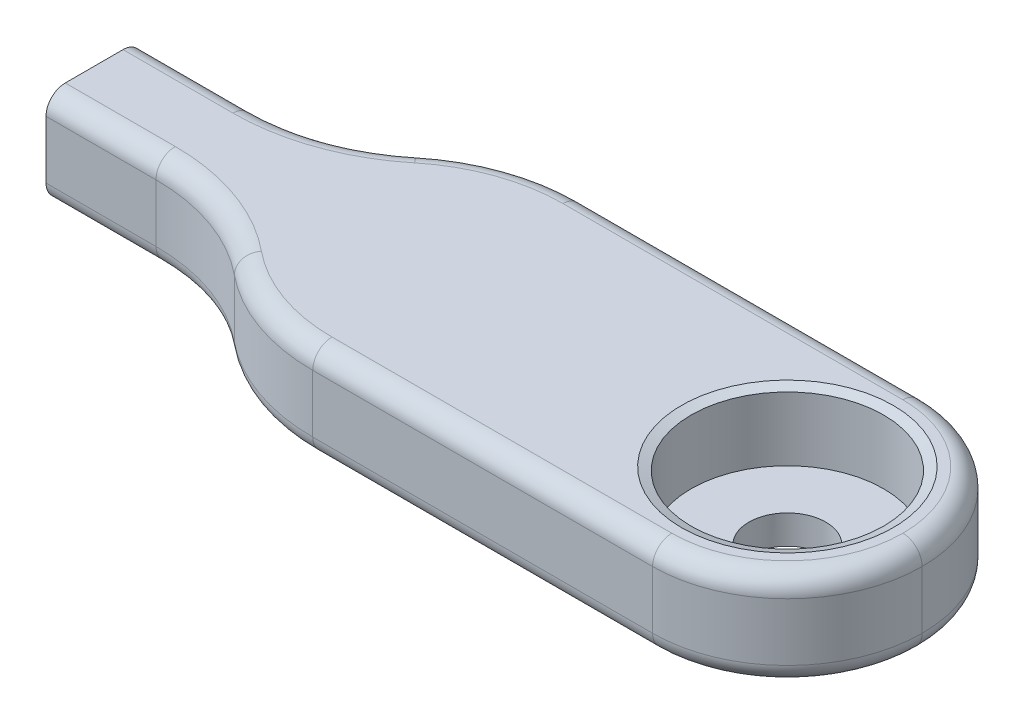
ISO-10303-21;
HEADER;
FILE_DESCRIPTION(('STEP AP214'),'2;1');
FILE_NAME('part.step','',(''),(''),'','','');
FILE_SCHEMA(('AUTOMOTIVE_DESIGN { 1 0 10303 214 1 1 1 1 }'));
ENDSEC;
DATA;
#1=APPLICATION_CONTEXT('core data for automotive mechanical design processes');
#2=APPLICATION_PROTOCOL_DEFINITION('international standard','automotive_design',2000,#1);
#3=PRODUCT_CONTEXT('',#1,'mechanical');
#4=PRODUCT('Part','Part','',(#3));
#5=PRODUCT_RELATED_PRODUCT_CATEGORY('part','',(#4));
#6=PRODUCT_DEFINITION_FORMATION('','',#4);
#7=PRODUCT_DEFINITION_CONTEXT('part definition',#1,'design');
#8=PRODUCT_DEFINITION('design','',#6,#7);
#9=PRODUCT_DEFINITION_SHAPE('','',#8);
#10=(LENGTH_UNIT() NAMED_UNIT(*) SI_UNIT(.MILLI.,.METRE.));
#11=(NAMED_UNIT(*) PLANE_ANGLE_UNIT() SI_UNIT($,.RADIAN.));
#12=(NAMED_UNIT(*) SI_UNIT($,.STERADIAN.) SOLID_ANGLE_UNIT());
#13=UNCERTAINTY_MEASURE_WITH_UNIT(LENGTH_MEASURE(1.E-05),#10,'distance_accuracy_value','');
#14=(GEOMETRIC_REPRESENTATION_CONTEXT(3) GLOBAL_UNCERTAINTY_ASSIGNED_CONTEXT((#13)) GLOBAL_UNIT_ASSIGNED_CONTEXT((#10,
#11,#12)) REPRESENTATION_CONTEXT('',''));
#15=CARTESIAN_POINT('',(0.,0.,0.));
#16=DIRECTION('',(0.,0.,1.));
#17=DIRECTION('',(1.,0.,0.));
#18=AXIS2_PLACEMENT_3D('',#15,#16,#17);
#19=CARTESIAN_POINT('',(-21.5,5.,-7.));
#20=DIRECTION('',(0.,0.,1.));
#21=DIRECTION('',(1.,0.,0.));
#22=AXIS2_PLACEMENT_3D('',#19,#20,#21);
#23=PLANE('',#22);
#24=DIRECTION('',(0.,-1.,0.));
#25=VECTOR('',#24,1.);
#26=CARTESIAN_POINT('',(14.5,5.,-7.));
#27=LINE('',#26,#25);
#28=CARTESIAN_POINT('',(14.5,4.,-7.));
#29=VERTEX_POINT('',#28);
#30=CARTESIAN_POINT('',(14.5,1.,-7.));
#31=VERTEX_POINT('',#30);
#32=EDGE_CURVE('E573',#29,#31,#27,.T.);
#33=ORIENTED_EDGE('',*,*,#32,.T.);
#34=DIRECTION('',(-1.,0.,0.));
#35=VECTOR('',#34,1.);
#36=CARTESIAN_POINT('',(-3.14835345575496,1.,-7.));
#37=LINE('',#36,#35);
#38=CARTESIAN_POINT('',(-3.14835345575496,1.,-7.));
#39=VERTEX_POINT('',#38);
#40=EDGE_CURVE('E243',#31,#39,#37,.T.);
#41=ORIENTED_EDGE('',*,*,#40,.T.);
#42=DIRECTION('',(0.,-1.,0.));
#43=VECTOR('',#42,1.);
#44=CARTESIAN_POINT('',(-3.14835345575496,5.,-7.));
#45=LINE('',#44,#43);
#46=CARTESIAN_POINT('',(-3.14835345575496,4.,-7.));
#47=VERTEX_POINT('',#46);
#48=EDGE_CURVE('E550',#39,#47,#45,.F.);
#49=ORIENTED_EDGE('',*,*,#48,.T.);
#50=DIRECTION('',(-1.,0.,0.));
#51=VECTOR('',#50,1.);
#52=CARTESIAN_POINT('',(-21.5,4.,-7.));
#53=LINE('',#52,#51);
#54=EDGE_CURVE('E240',#47,#29,#53,.F.);
#55=ORIENTED_EDGE('',*,*,#54,.T.);
#56=EDGE_LOOP('',(#33,#41,#49,#55));
#57=FACE_BOUND('',#56,.T.);
#58=ADVANCED_FACE('F41',(#57),#23,.F.);
#59=CARTESIAN_POINT('',(-21.5,5.,7.));
#60=DIRECTION('',(1.,0.,0.));
#61=DIRECTION('',(0.,0.,-1.));
#62=AXIS2_PLACEMENT_3D('',#59,#60,#61);
#63=PLANE('',#62);
#64=CARTESIAN_POINT('',(-21.5,2.5,0.));
#65=DIRECTION('',(-1.,0.,0.));
#66=DIRECTION('',(0.,0.,1.));
#67=AXIS2_PLACEMENT_3D('',#64,#65,#66);
#68=CIRCLE('',#67,2.2);
#69=CARTESIAN_POINT('',(-21.5,2.5,2.2));
#70=VERTEX_POINT('',#69);
#71=EDGE_CURVE('E364',#70,#70,#68,.T.);
#72=ORIENTED_EDGE('',*,*,#71,.F.);
#73=EDGE_LOOP('',(#72));
#74=FACE_BOUND('',#73,.T.);
#75=DIRECTION('',(0.,1.,0.));
#76=VECTOR('',#75,1.);
#77=CARTESIAN_POINT('',(-21.5,-5.,-2.5));
#78=LINE('',#77,#76);
#79=CARTESIAN_POINT('',(-21.5,1.,-2.5));
#80=VERTEX_POINT('',#79);
#81=CARTESIAN_POINT('',(-21.5,4.,-2.5));
#82=VERTEX_POINT('',#81);
#83=EDGE_CURVE('E198',#80,#82,#78,.T.);
#84=ORIENTED_EDGE('',*,*,#83,.F.);
#85=CARTESIAN_POINT('',(-21.5,1.,-1.5));
#86=DIRECTION('',(1.,0.,0.));
#87=DIRECTION('',(0.,0.,-1.));
#88=AXIS2_PLACEMENT_3D('',#85,#86,#87);
#89=CIRCLE('',#88,1.);
#90=CARTESIAN_POINT('',(-21.5,0.,-1.5));
#91=VERTEX_POINT('',#90);
#92=EDGE_CURVE('E193',#80,#91,#89,.F.);
#93=ORIENTED_EDGE('',*,*,#92,.T.);
#94=DIRECTION('',(0.,0.,1.));
#95=VECTOR('',#94,1.);
#96=CARTESIAN_POINT('',(-21.5,0.,7.));
#97=LINE('',#96,#95);
#98=CARTESIAN_POINT('',(-21.5,0.,1.5));
#99=VERTEX_POINT('',#98);
#100=EDGE_CURVE('E196',#91,#99,#97,.T.);
#101=ORIENTED_EDGE('',*,*,#100,.T.);
#102=CARTESIAN_POINT('',(-21.5,1.,1.5));
#103=DIRECTION('',(1.,0.,0.));
#104=DIRECTION('',(0.,0.,-1.));
#105=AXIS2_PLACEMENT_3D('',#102,#103,#104);
#106=CIRCLE('',#105,1.);
#107=CARTESIAN_POINT('',(-21.5,1.,2.5));
#108=VERTEX_POINT('',#107);
#109=EDGE_CURVE('E65',#99,#108,#106,.F.);
#110=ORIENTED_EDGE('',*,*,#109,.T.);
#111=DIRECTION('',(0.,1.,0.));
#112=VECTOR('',#111,1.);
#113=CARTESIAN_POINT('',(-21.5,-5.,2.5));
#114=LINE('',#113,#112);
#115=CARTESIAN_POINT('',(-21.5,4.,2.5));
#116=VERTEX_POINT('',#115);
#117=EDGE_CURVE('E541',#108,#116,#114,.T.);
#118=ORIENTED_EDGE('',*,*,#117,.T.);
#119=CARTESIAN_POINT('',(-21.5,4.,1.5));
#120=DIRECTION('',(1.,0.,0.));
#121=DIRECTION('',(0.,0.,-1.));
#122=AXIS2_PLACEMENT_3D('',#119,#120,#121);
#123=CIRCLE('',#122,1.);
#124=CARTESIAN_POINT('',(-21.5,5.,1.5));
#125=VERTEX_POINT('',#124);
#126=EDGE_CURVE('E313',#116,#125,#123,.F.);
#127=ORIENTED_EDGE('',*,*,#126,.T.);
#128=DIRECTION('',(0.,0.,1.));
#129=VECTOR('',#128,1.);
#130=CARTESIAN_POINT('',(-21.5,5.,7.));
#131=LINE('',#130,#129);
#132=CARTESIAN_POINT('',(-21.5,5.,-1.5));
#133=VERTEX_POINT('',#132);
#134=EDGE_CURVE('E213',#133,#125,#131,.T.);
#135=ORIENTED_EDGE('',*,*,#134,.F.);
#136=CARTESIAN_POINT('',(-21.5,4.,-1.5));
#137=DIRECTION('',(1.,0.,0.));
#138=DIRECTION('',(0.,0.,-1.));
#139=AXIS2_PLACEMENT_3D('',#136,#137,#138);
#140=CIRCLE('',#139,1.);
#141=EDGE_CURVE('E203',#133,#82,#140,.F.);
#142=ORIENTED_EDGE('',*,*,#141,.T.);
#143=EDGE_LOOP('',(#84,#93,#101,#110,#118,#127,#135,#142));
#144=FACE_BOUND('',#143,.T.);
#145=ADVANCED_FACE('F195',(#74,#144),#63,.F.);
#146=CARTESIAN_POINT('',(-21.5,5.,7.));
#147=DIRECTION('',(0.,0.,-1.));
#148=DIRECTION('',(-1.,0.,0.));
#149=AXIS2_PLACEMENT_3D('',#146,#147,#148);
#150=PLANE('',#149);
#151=DIRECTION('',(0.,1.,0.));
#152=VECTOR('',#151,1.);
#153=CARTESIAN_POINT('',(-3.14835345575497,5.,7.));
#154=LINE('',#153,#152);
#155=CARTESIAN_POINT('',(-3.14835345575497,4.,7.));
#156=VERTEX_POINT('',#155);
#157=CARTESIAN_POINT('',(-3.14835345575497,1.,7.));
#158=VERTEX_POINT('',#157);
#159=EDGE_CURVE('E546',#156,#158,#154,.F.);
#160=ORIENTED_EDGE('',*,*,#159,.T.);
#161=DIRECTION('',(1.,0.,0.));
#162=VECTOR('',#161,1.);
#163=CARTESIAN_POINT('',(14.5,1.,7.));
#164=LINE('',#163,#162);
#165=CARTESIAN_POINT('',(14.5,1.,7.));
#166=VERTEX_POINT('',#165);
#167=EDGE_CURVE('E261',#158,#166,#164,.T.);
#168=ORIENTED_EDGE('',*,*,#167,.T.);
#169=DIRECTION('',(0.,-1.,0.));
#170=VECTOR('',#169,1.);
#171=CARTESIAN_POINT('',(14.5,5.,7.));
#172=LINE('',#171,#170);
#173=CARTESIAN_POINT('',(14.5,4.,7.));
#174=VERTEX_POINT('',#173);
#175=EDGE_CURVE('E576',#166,#174,#172,.F.);
#176=ORIENTED_EDGE('',*,*,#175,.T.);
#177=DIRECTION('',(1.,0.,0.));
#178=VECTOR('',#177,1.);
#179=CARTESIAN_POINT('',(-21.5,4.,7.));
#180=LINE('',#179,#178);
#181=EDGE_CURVE('E258',#174,#156,#180,.F.);
#182=ORIENTED_EDGE('',*,*,#181,.T.);
#183=EDGE_LOOP('',(#160,#168,#176,#182));
#184=FACE_BOUND('',#183,.T.);
#185=ADVANCED_FACE('F419',(#184),#150,.F.);
#186=CARTESIAN_POINT('',(0.,5.,0.));
#187=DIRECTION('',(0.,-1.,0.));
#188=DIRECTION('',(0.,0.,-1.));
#189=AXIS2_PLACEMENT_3D('',#186,#187,#188);
#190=PLANE('',#189);
#191=CARTESIAN_POINT('',(14.5,5.,0.));
#192=DIRECTION('',(0.,-1.,0.));
#193=DIRECTION('',(0.,0.,-1.));
#194=AXIS2_PLACEMENT_3D('',#191,#192,#193);
#195=CIRCLE('',#194,5.50000000000001);
#196=CARTESIAN_POINT('',(14.5,5.,-5.50000000000001));
#197=VERTEX_POINT('',#196);
#198=EDGE_CURVE('E587',#197,#197,#195,.T.);
#199=ORIENTED_EDGE('',*,*,#198,.T.);
#200=EDGE_LOOP('',(#199));
#201=FACE_BOUND('',#200,.T.);
#202=CARTESIAN_POINT('',(-15.7875781155195,5.,-12.5));
#203=DIRECTION('',(0.,-1.,0.));
#204=DIRECTION('',(0.,0.,-1.));
#205=AXIS2_PLACEMENT_3D('',#202,#203,#204);
#206=CIRCLE('',#205,11.);
#207=CARTESIAN_POINT('',(-8.83600455264901,5.,-3.975));
#208=VERTEX_POINT('',#207);
#209=CARTESIAN_POINT('',(-15.7875781155195,5.,-1.5));
#210=VERTEX_POINT('',#209);
#211=EDGE_CURVE('E300',#208,#210,#206,.T.);
#212=ORIENTED_EDGE('',*,*,#211,.T.);
#213=DIRECTION('',(1.,0.,0.));
#214=VECTOR('',#213,1.);
#215=CARTESIAN_POINT('',(0.,5.,-1.5));
#216=LINE('',#215,#214);
#217=EDGE_CURVE('E304',#210,#133,#216,.F.);
#218=ORIENTED_EDGE('',*,*,#217,.T.);
#219=ORIENTED_EDGE('',*,*,#134,.T.);
#220=DIRECTION('',(-1.,0.,0.));
#221=VECTOR('',#220,1.);
#222=CARTESIAN_POINT('',(0.,5.,1.5));
#223=LINE('',#222,#221);
#224=CARTESIAN_POINT('',(-15.7875781155195,5.,1.5));
#225=VERTEX_POINT('',#224);
#226=EDGE_CURVE('E276',#125,#225,#223,.F.);
#227=ORIENTED_EDGE('',*,*,#226,.T.);
#228=CARTESIAN_POINT('',(-15.7875781155195,5.,12.5));
#229=DIRECTION('',(0.,-1.,0.));
#230=DIRECTION('',(0.,0.,-1.));
#231=AXIS2_PLACEMENT_3D('',#228,#229,#230);
#232=CIRCLE('',#231,11.);
#233=CARTESIAN_POINT('',(-8.83600455264901,5.,3.975));
#234=VERTEX_POINT('',#233);
#235=EDGE_CURVE('E279',#225,#234,#232,.T.);
#236=ORIENTED_EDGE('',*,*,#235,.T.);
#237=CARTESIAN_POINT('',(-3.14835345575497,5.,-3.));
#238=DIRECTION('',(0.,-1.,0.));
#239=DIRECTION('',(0.,0.,-1.));
#240=AXIS2_PLACEMENT_3D('',#237,#238,#239);
#241=CIRCLE('',#240,9.);
#242=CARTESIAN_POINT('',(-3.14835345575497,5.,6.));
#243=VERTEX_POINT('',#242);
#244=EDGE_CURVE('E282',#234,#243,#241,.F.);
#245=ORIENTED_EDGE('',*,*,#244,.T.);
#246=DIRECTION('',(1.,0.,0.));
#247=VECTOR('',#246,1.);
#248=CARTESIAN_POINT('',(0.,5.,6.));
#249=LINE('',#248,#247);
#250=CARTESIAN_POINT('',(14.5,5.,6.));
#251=VERTEX_POINT('',#250);
#252=EDGE_CURVE('E285',#243,#251,#249,.T.);
#253=ORIENTED_EDGE('',*,*,#252,.T.);
#254=CARTESIAN_POINT('',(14.5,5.,0.));
#255=DIRECTION('',(0.,-1.,0.));
#256=DIRECTION('',(0.,0.,-1.));
#257=AXIS2_PLACEMENT_3D('',#254,#255,#256);
#258=CIRCLE('',#257,6.);
#259=CARTESIAN_POINT('',(20.5,5.,0.));
#260=VERTEX_POINT('',#259);
#261=EDGE_CURVE('E288',#251,#260,#258,.F.);
#262=ORIENTED_EDGE('',*,*,#261,.T.);
#263=CARTESIAN_POINT('',(14.5,5.,0.));
#264=DIRECTION('',(0.,-1.,0.));
#265=DIRECTION('',(0.,0.,-1.));
#266=AXIS2_PLACEMENT_3D('',#263,#264,#265);
#267=CIRCLE('',#266,6.);
#268=CARTESIAN_POINT('',(14.5,5.,-6.));
#269=VERTEX_POINT('',#268);
#270=EDGE_CURVE('E291',#260,#269,#267,.F.);
#271=ORIENTED_EDGE('',*,*,#270,.T.);
#272=DIRECTION('',(-1.,0.,0.));
#273=VECTOR('',#272,1.);
#274=CARTESIAN_POINT('',(0.,5.,-6.));
#275=LINE('',#274,#273);
#276=CARTESIAN_POINT('',(-3.14835345575496,5.,-6.));
#277=VERTEX_POINT('',#276);
#278=EDGE_CURVE('E294',#269,#277,#275,.T.);
#279=ORIENTED_EDGE('',*,*,#278,.T.);
#280=CARTESIAN_POINT('',(-3.14835345575497,5.,3.));
#281=DIRECTION('',(0.,-1.,0.));
#282=DIRECTION('',(0.,0.,-1.));
#283=AXIS2_PLACEMENT_3D('',#280,#281,#282);
#284=CIRCLE('',#283,9.);
#285=EDGE_CURVE('E297',#277,#208,#284,.F.);
#286=ORIENTED_EDGE('',*,*,#285,.T.);
#287=EDGE_LOOP('',(#212,#218,#219,#227,#236,#245,#253,#262,#271,#279,#286));
#288=FACE_BOUND('',#287,.T.);
#289=ADVANCED_FACE('F543',(#201,#288),#190,.F.);
#290=CARTESIAN_POINT('',(0.,0.,0.));
#291=DIRECTION('',(0.,-1.,0.));
#292=DIRECTION('',(0.,0.,-1.));
#293=AXIS2_PLACEMENT_3D('',#290,#291,#292);
#294=PLANE('',#293);
#295=CARTESIAN_POINT('',(14.5,0.,0.));
#296=DIRECTION('',(0.,-1.,0.));
#297=DIRECTION('',(0.,0.,-1.));
#298=AXIS2_PLACEMENT_3D('',#295,#296,#297);
#299=CIRCLE('',#298,2.);
#300=CARTESIAN_POINT('',(14.5,0.,-2.));
#301=VERTEX_POINT('',#300);
#302=EDGE_CURVE('E45',#301,#301,#299,.T.);
#303=ORIENTED_EDGE('',*,*,#302,.F.);
#304=EDGE_LOOP('',(#303));
#305=FACE_BOUND('',#304,.T.);
#306=ORIENTED_EDGE('',*,*,#100,.F.);
#307=DIRECTION('',(-1.,0.,0.));
#308=VECTOR('',#307,1.);
#309=CARTESIAN_POINT('',(-15.7875781155195,0.,-1.5));
#310=LINE('',#309,#308);
#311=CARTESIAN_POINT('',(-15.7875781155195,0.,-1.5));
#312=VERTEX_POINT('',#311);
#313=EDGE_CURVE('E208',#91,#312,#310,.F.);
#314=ORIENTED_EDGE('',*,*,#313,.T.);
#315=CARTESIAN_POINT('',(-15.7875781155195,0.,-12.5));
#316=DIRECTION('',(0.,-1.,0.));
#317=DIRECTION('',(0.,0.,-1.));
#318=AXIS2_PLACEMENT_3D('',#315,#316,#317);
#319=CIRCLE('',#318,11.);
#320=CARTESIAN_POINT('',(-8.83600455264901,0.,-3.975));
#321=VERTEX_POINT('',#320);
#322=EDGE_CURVE('E222',#312,#321,#319,.F.);
#323=ORIENTED_EDGE('',*,*,#322,.T.);
#324=CARTESIAN_POINT('',(-3.14835345575497,0.,3.));
#325=DIRECTION('',(0.,-1.,0.));
#326=DIRECTION('',(0.,0.,-1.));
#327=AXIS2_PLACEMENT_3D('',#324,#325,#326);
#328=CIRCLE('',#327,9.);
#329=CARTESIAN_POINT('',(-3.14835345575496,0.,-6.));
#330=VERTEX_POINT('',#329);
#331=EDGE_CURVE('E228',#321,#330,#328,.T.);
#332=ORIENTED_EDGE('',*,*,#331,.T.);
#333=DIRECTION('',(-1.,0.,0.));
#334=VECTOR('',#333,1.);
#335=CARTESIAN_POINT('',(14.5,0.,-6.));
#336=LINE('',#335,#334);
#337=CARTESIAN_POINT('',(14.5,0.,-6.));
#338=VERTEX_POINT('',#337);
#339=EDGE_CURVE('E608',#330,#338,#336,.F.);
#340=ORIENTED_EDGE('',*,*,#339,.T.);
#341=CARTESIAN_POINT('',(14.5,0.,0.));
#342=DIRECTION('',(0.,-1.,0.));
#343=DIRECTION('',(0.,0.,-1.));
#344=AXIS2_PLACEMENT_3D('',#341,#342,#343);
#345=CIRCLE('',#344,6.);
#346=CARTESIAN_POINT('',(20.5,0.,0.));
#347=VERTEX_POINT('',#346);
#348=EDGE_CURVE('E605',#338,#347,#345,.T.);
#349=ORIENTED_EDGE('',*,*,#348,.T.);
#350=CARTESIAN_POINT('',(14.5,0.,0.));
#351=DIRECTION('',(0.,-1.,0.));
#352=DIRECTION('',(0.,0.,-1.));
#353=AXIS2_PLACEMENT_3D('',#350,#351,#352);
#354=CIRCLE('',#353,6.);
#355=CARTESIAN_POINT('',(14.5,0.,6.));
#356=VERTEX_POINT('',#355);
#357=EDGE_CURVE('E602',#347,#356,#354,.T.);
#358=ORIENTED_EDGE('',*,*,#357,.T.);
#359=DIRECTION('',(1.,0.,0.));
#360=VECTOR('',#359,1.);
#361=CARTESIAN_POINT('',(-3.14835345575497,0.,6.));
#362=LINE('',#361,#360);
#363=CARTESIAN_POINT('',(-3.14835345575497,0.,6.));
#364=VERTEX_POINT('',#363);
#365=EDGE_CURVE('E599',#356,#364,#362,.F.);
#366=ORIENTED_EDGE('',*,*,#365,.T.);
#367=CARTESIAN_POINT('',(-3.14835345575497,0.,-3.));
#368=DIRECTION('',(0.,-1.,0.));
#369=DIRECTION('',(0.,0.,-1.));
#370=AXIS2_PLACEMENT_3D('',#367,#368,#369);
#371=CIRCLE('',#370,9.);
#372=CARTESIAN_POINT('',(-8.83600455264901,0.,3.975));
#373=VERTEX_POINT('',#372);
#374=EDGE_CURVE('E596',#364,#373,#371,.T.);
#375=ORIENTED_EDGE('',*,*,#374,.T.);
#376=CARTESIAN_POINT('',(-15.7875781155195,0.,12.5));
#377=DIRECTION('',(0.,-1.,0.));
#378=DIRECTION('',(0.,0.,-1.));
#379=AXIS2_PLACEMENT_3D('',#376,#377,#378);
#380=CIRCLE('',#379,11.);
#381=CARTESIAN_POINT('',(-15.7875781155195,0.,1.5));
#382=VERTEX_POINT('',#381);
#383=EDGE_CURVE('E593',#373,#382,#380,.F.);
#384=ORIENTED_EDGE('',*,*,#383,.T.);
#385=DIRECTION('',(1.,0.,0.));
#386=VECTOR('',#385,1.);
#387=CARTESIAN_POINT('',(-21.5,0.,1.5));
#388=LINE('',#387,#386);
#389=EDGE_CURVE('E211',#382,#99,#388,.F.);
#390=ORIENTED_EDGE('',*,*,#389,.T.);
#391=EDGE_LOOP('',(#306,#314,#323,#332,#340,#349,#358,#366,#375,#384,#390));
#392=FACE_BOUND('',#391,.T.);
#393=ADVANCED_FACE('F206',(#305,#392),#294,.T.);
#394=CARTESIAN_POINT('',(14.5,1.5,0.));
#395=DIRECTION('',(0.,1.,0.));
#396=DIRECTION('',(0.,0.,1.));
#397=AXIS2_PLACEMENT_3D('',#394,#395,#396);
#398=CYLINDRICAL_SURFACE('',#397,5.);
#399=CARTESIAN_POINT('',(14.5,4.8180148828669,0.));
#400=DIRECTION('',(0.,-1.,0.));
#401=DIRECTION('',(0.,0.,-1.));
#402=AXIS2_PLACEMENT_3D('',#399,#400,#401);
#403=CIRCLE('',#402,5.);
#404=CARTESIAN_POINT('',(14.5,4.8180148828669,-5.));
#405=VERTEX_POINT('',#404);
#406=EDGE_CURVE('E580',#405,#405,#403,.F.);
#407=ORIENTED_EDGE('',*,*,#406,.T.);
#408=EDGE_LOOP('',(#407));
#409=FACE_BOUND('',#408,.T.);
#410=CARTESIAN_POINT('',(14.5,1.5,0.));
#411=DIRECTION('',(0.,1.,0.));
#412=DIRECTION('',(0.,0.,1.));
#413=AXIS2_PLACEMENT_3D('',#410,#411,#412);
#414=CIRCLE('',#413,5.);
#415=CARTESIAN_POINT('',(14.5,1.5,5.));
#416=VERTEX_POINT('',#415);
#417=EDGE_CURVE('E214',#416,#416,#414,.T.);
#418=ORIENTED_EDGE('',*,*,#417,.F.);
#419=EDGE_LOOP('',(#418));
#420=FACE_BOUND('',#419,.T.);
#421=ADVANCED_FACE('F688',(#409,#420),#398,.F.);
#422=CARTESIAN_POINT('',(14.5,1.5,0.));
#423=DIRECTION('',(0.,1.,0.));
#424=DIRECTION('',(0.,0.,1.));
#425=AXIS2_PLACEMENT_3D('',#422,#423,#424);
#426=PLANE('',#425);
#427=CARTESIAN_POINT('',(14.5,1.5,0.));
#428=DIRECTION('',(0.,1.,0.));
#429=DIRECTION('',(0.,0.,1.));
#430=AXIS2_PLACEMENT_3D('',#427,#428,#429);
#431=CIRCLE('',#430,2.);
#432=CARTESIAN_POINT('',(14.5,1.5,2.));
#433=VERTEX_POINT('',#432);
#434=EDGE_CURVE('E678',#433,#433,#431,.T.);
#435=ORIENTED_EDGE('',*,*,#434,.F.);
#436=EDGE_LOOP('',(#435));
#437=FACE_BOUND('',#436,.T.);
#438=ORIENTED_EDGE('',*,*,#417,.T.);
#439=EDGE_LOOP('',(#438));
#440=FACE_BOUND('',#439,.T.);
#441=ADVANCED_FACE('F694',(#437,#440),#426,.T.);
#442=CARTESIAN_POINT('',(-21.5,-5.,2.5));
#443=DIRECTION('',(0.,0.,-1.));
#444=DIRECTION('',(-1.,0.,0.));
#445=AXIS2_PLACEMENT_3D('',#442,#443,#444);
#446=PLANE('',#445);
#447=ORIENTED_EDGE('',*,*,#117,.F.);
#448=DIRECTION('',(1.,0.,0.));
#449=VECTOR('',#448,1.);
#450=CARTESIAN_POINT('',(-15.7875781155195,1.,2.5));
#451=LINE('',#450,#449);
#452=CARTESIAN_POINT('',(-15.7875781155195,1.,2.5));
#453=VERTEX_POINT('',#452);
#454=EDGE_CURVE('E322',#108,#453,#451,.T.);
#455=ORIENTED_EDGE('',*,*,#454,.T.);
#456=DIRECTION('',(0.,1.,0.));
#457=VECTOR('',#456,1.);
#458=CARTESIAN_POINT('',(-15.7875781155195,-5.,2.5));
#459=LINE('',#458,#457);
#460=CARTESIAN_POINT('',(-15.7875781155195,4.,2.5));
#461=VERTEX_POINT('',#460);
#462=EDGE_CURVE('E566',#453,#461,#459,.T.);
#463=ORIENTED_EDGE('',*,*,#462,.T.);
#464=DIRECTION('',(-1.,0.,0.));
#465=VECTOR('',#464,1.);
#466=CARTESIAN_POINT('',(-21.5,4.,2.5));
#467=LINE('',#466,#465);
#468=EDGE_CURVE('E58',#461,#116,#467,.T.);
#469=ORIENTED_EDGE('',*,*,#468,.T.);
#470=EDGE_LOOP('',(#447,#455,#463,#469));
#471=FACE_BOUND('',#470,.T.);
#472=ADVANCED_FACE('F660',(#471),#446,.F.);
#473=CARTESIAN_POINT('',(-21.5,-5.,-2.5));
#474=DIRECTION('',(0.,0.,1.));
#475=DIRECTION('',(1.,0.,0.));
#476=AXIS2_PLACEMENT_3D('',#473,#474,#475);
#477=PLANE('',#476);
#478=DIRECTION('',(0.,-1.,0.));
#479=VECTOR('',#478,1.);
#480=CARTESIAN_POINT('',(-15.7875781155195,-5.,-2.5));
#481=LINE('',#480,#479);
#482=CARTESIAN_POINT('',(-15.7875781155195,4.,-2.5));
#483=VERTEX_POINT('',#482);
#484=CARTESIAN_POINT('',(-15.7875781155195,1.,-2.5));
#485=VERTEX_POINT('',#484);
#486=EDGE_CURVE('E562',#483,#485,#481,.T.);
#487=ORIENTED_EDGE('',*,*,#486,.T.);
#488=DIRECTION('',(-1.,0.,0.));
#489=VECTOR('',#488,1.);
#490=CARTESIAN_POINT('',(-21.5,1.,-2.5));
#491=LINE('',#490,#489);
#492=EDGE_CURVE('E310',#485,#80,#491,.T.);
#493=ORIENTED_EDGE('',*,*,#492,.T.);
#494=ORIENTED_EDGE('',*,*,#83,.T.);
#495=DIRECTION('',(1.,0.,0.));
#496=VECTOR('',#495,1.);
#497=CARTESIAN_POINT('',(-21.5,4.,-2.5));
#498=LINE('',#497,#496);
#499=EDGE_CURVE('E307',#82,#483,#498,.T.);
#500=ORIENTED_EDGE('',*,*,#499,.T.);
#501=EDGE_LOOP('',(#487,#493,#494,#500));
#502=FACE_BOUND('',#501,.T.);
#503=ADVANCED_FACE('F429',(#502),#477,.F.);
#504=CARTESIAN_POINT('',(-3.14835345575497,-5.,-3.));
#505=DIRECTION('',(0.,1.,0.));
#506=DIRECTION('',(0.,0.,1.));
#507=AXIS2_PLACEMENT_3D('',#504,#505,#506);
#508=CYLINDRICAL_SURFACE('',#507,10.);
#509=DIRECTION('',(0.,1.,0.));
#510=VECTOR('',#509,1.);
#511=CARTESIAN_POINT('',(-9.46796578563724,-5.,4.75));
#512=LINE('',#511,#510);
#513=CARTESIAN_POINT('',(-9.46796578563724,4.,4.75));
#514=VERTEX_POINT('',#513);
#515=CARTESIAN_POINT('',(-9.46796578563724,1.,4.75));
#516=VERTEX_POINT('',#515);
#517=EDGE_CURVE('E569',#514,#516,#512,.F.);
#518=ORIENTED_EDGE('',*,*,#517,.T.);
#519=CARTESIAN_POINT('',(-3.14835345575497,1.,-3.));
#520=DIRECTION('',(0.,-1.,0.));
#521=DIRECTION('',(0.,0.,-1.));
#522=AXIS2_PLACEMENT_3D('',#519,#520,#521);
#523=CIRCLE('',#522,10.);
#524=EDGE_CURVE('E267',#516,#158,#523,.F.);
#525=ORIENTED_EDGE('',*,*,#524,.T.);
#526=ORIENTED_EDGE('',*,*,#159,.F.);
#527=CARTESIAN_POINT('',(-3.14835345575497,4.,-3.));
#528=DIRECTION('',(0.,-1.,0.));
#529=DIRECTION('',(0.,0.,-1.));
#530=AXIS2_PLACEMENT_3D('',#527,#528,#529);
#531=CIRCLE('',#530,10.);
#532=EDGE_CURVE('E264',#156,#514,#531,.T.);
#533=ORIENTED_EDGE('',*,*,#532,.T.);
#534=EDGE_LOOP('',(#518,#525,#526,#533));
#535=FACE_BOUND('',#534,.T.);
#536=ADVANCED_FACE('F425',(#535),#508,.T.);
#537=CARTESIAN_POINT('',(-3.14835345575497,-5.,3.));
#538=DIRECTION('',(0.,-1.,0.));
#539=DIRECTION('',(0.,0.,-1.));
#540=AXIS2_PLACEMENT_3D('',#537,#538,#539);
#541=CYLINDRICAL_SURFACE('',#540,10.);
#542=ORIENTED_EDGE('',*,*,#48,.F.);
#543=CARTESIAN_POINT('',(-3.14835345575497,1.,3.));
#544=DIRECTION('',(0.,-1.,0.));
#545=DIRECTION('',(0.,0.,-1.));
#546=AXIS2_PLACEMENT_3D('',#543,#544,#545);
#547=CIRCLE('',#546,10.);
#548=CARTESIAN_POINT('',(-9.46796578563724,1.,-4.75));
#549=VERTEX_POINT('',#548);
#550=EDGE_CURVE('E237',#39,#549,#547,.F.);
#551=ORIENTED_EDGE('',*,*,#550,.T.);
#552=DIRECTION('',(0.,-1.,0.));
#553=VECTOR('',#552,1.);
#554=CARTESIAN_POINT('',(-9.46796578563724,-5.,-4.75));
#555=LINE('',#554,#553);
#556=CARTESIAN_POINT('',(-9.46796578563724,4.,-4.75));
#557=VERTEX_POINT('',#556);
#558=EDGE_CURVE('E558',#549,#557,#555,.F.);
#559=ORIENTED_EDGE('',*,*,#558,.T.);
#560=CARTESIAN_POINT('',(-3.14835345575497,4.,3.));
#561=DIRECTION('',(0.,-1.,0.));
#562=DIRECTION('',(0.,0.,-1.));
#563=AXIS2_PLACEMENT_3D('',#560,#561,#562);
#564=CIRCLE('',#563,10.);
#565=EDGE_CURVE('E234',#557,#47,#564,.T.);
#566=ORIENTED_EDGE('',*,*,#565,.T.);
#567=EDGE_LOOP('',(#542,#551,#559,#566));
#568=FACE_BOUND('',#567,.T.);
#569=ADVANCED_FACE('F428',(#568),#541,.T.);
#570=CARTESIAN_POINT('',(-15.7875781155195,-5.,-12.5));
#571=DIRECTION('',(0.,-1.,0.));
#572=DIRECTION('',(0.,0.,-1.));
#573=AXIS2_PLACEMENT_3D('',#570,#571,#572);
#574=CYLINDRICAL_SURFACE('',#573,10.);
#575=ORIENTED_EDGE('',*,*,#558,.F.);
#576=CARTESIAN_POINT('',(-15.7875781155195,1.,-12.5));
#577=DIRECTION('',(0.,-1.,0.));
#578=DIRECTION('',(0.,0.,-1.));
#579=AXIS2_PLACEMENT_3D('',#576,#577,#578);
#580=CIRCLE('',#579,10.);
#581=EDGE_CURVE('E226',#549,#485,#580,.T.);
#582=ORIENTED_EDGE('',*,*,#581,.T.);
#583=ORIENTED_EDGE('',*,*,#486,.F.);
#584=CARTESIAN_POINT('',(-15.7875781155195,4.,-12.5));
#585=DIRECTION('',(0.,-1.,0.));
#586=DIRECTION('',(0.,0.,-1.));
#587=AXIS2_PLACEMENT_3D('',#584,#585,#586);
#588=CIRCLE('',#587,10.);
#589=EDGE_CURVE('E221',#483,#557,#588,.F.);
#590=ORIENTED_EDGE('',*,*,#589,.T.);
#591=EDGE_LOOP('',(#575,#582,#583,#590));
#592=FACE_BOUND('',#591,.T.);
#593=ADVANCED_FACE('F433',(#592),#574,.F.);
#594=CARTESIAN_POINT('',(-15.7875781155195,-5.,12.5));
#595=DIRECTION('',(0.,1.,0.));
#596=DIRECTION('',(0.,0.,1.));
#597=AXIS2_PLACEMENT_3D('',#594,#595,#596);
#598=CYLINDRICAL_SURFACE('',#597,10.);
#599=ORIENTED_EDGE('',*,*,#462,.F.);
#600=CARTESIAN_POINT('',(-15.7875781155195,1.,12.5));
#601=DIRECTION('',(0.,-1.,0.));
#602=DIRECTION('',(0.,0.,-1.));
#603=AXIS2_PLACEMENT_3D('',#600,#601,#602);
#604=CIRCLE('',#603,10.);
#605=EDGE_CURVE('E273',#453,#516,#604,.T.);
#606=ORIENTED_EDGE('',*,*,#605,.T.);
#607=ORIENTED_EDGE('',*,*,#517,.F.);
#608=CARTESIAN_POINT('',(-15.7875781155195,4.,12.5));
#609=DIRECTION('',(0.,-1.,0.));
#610=DIRECTION('',(0.,0.,-1.));
#611=AXIS2_PLACEMENT_3D('',#608,#609,#610);
#612=CIRCLE('',#611,10.);
#613=EDGE_CURVE('E270',#514,#461,#612,.F.);
#614=ORIENTED_EDGE('',*,*,#613,.T.);
#615=EDGE_LOOP('',(#599,#606,#607,#614));
#616=FACE_BOUND('',#615,.T.);
#617=ADVANCED_FACE('F437',(#616),#598,.F.);
#618=CARTESIAN_POINT('',(14.5,5.,0.));
#619=DIRECTION('',(0.,-1.,0.));
#620=DIRECTION('',(0.,0.,-1.));
#621=AXIS2_PLACEMENT_3D('',#618,#619,#620);
#622=CYLINDRICAL_SURFACE('',#621,7.);
#623=ORIENTED_EDGE('',*,*,#175,.F.);
#624=CARTESIAN_POINT('',(14.5,1.,0.));
#625=DIRECTION('',(0.,-1.,0.));
#626=DIRECTION('',(0.,0.,-1.));
#627=AXIS2_PLACEMENT_3D('',#624,#625,#626);
#628=CIRCLE('',#627,7.);
#629=CARTESIAN_POINT('',(21.5,1.,0.));
#630=VERTEX_POINT('',#629);
#631=EDGE_CURVE('E255',#166,#630,#628,.F.);
#632=ORIENTED_EDGE('',*,*,#631,.T.);
#633=DIRECTION('',(0.,-1.,0.));
#634=VECTOR('',#633,1.);
#635=CARTESIAN_POINT('',(21.5,5.,0.));
#636=LINE('',#635,#634);
#637=CARTESIAN_POINT('',(21.5,4.,0.));
#638=VERTEX_POINT('',#637);
#639=EDGE_CURVE('E359',#638,#630,#636,.T.);
#640=ORIENTED_EDGE('',*,*,#639,.F.);
#641=CARTESIAN_POINT('',(14.5,4.,0.));
#642=DIRECTION('',(0.,-1.,0.));
#643=DIRECTION('',(0.,0.,-1.));
#644=AXIS2_PLACEMENT_3D('',#641,#642,#643);
#645=CIRCLE('',#644,7.);
#646=EDGE_CURVE('E252',#638,#174,#645,.T.);
#647=ORIENTED_EDGE('',*,*,#646,.T.);
#648=EDGE_LOOP('',(#623,#632,#640,#647));
#649=FACE_BOUND('',#648,.T.);
#650=ADVANCED_FACE('F441',(#649),#622,.T.);
#651=CARTESIAN_POINT('',(14.5,5.,0.));
#652=DIRECTION('',(0.,-1.,0.));
#653=DIRECTION('',(0.,0.,-1.));
#654=AXIS2_PLACEMENT_3D('',#651,#652,#653);
#655=CYLINDRICAL_SURFACE('',#654,7.);
#656=ORIENTED_EDGE('',*,*,#639,.T.);
#657=CARTESIAN_POINT('',(14.5,1.,0.));
#658=DIRECTION('',(0.,-1.,0.));
#659=DIRECTION('',(0.,0.,-1.));
#660=AXIS2_PLACEMENT_3D('',#657,#658,#659);
#661=CIRCLE('',#660,7.);
#662=EDGE_CURVE('E249',#630,#31,#661,.F.);
#663=ORIENTED_EDGE('',*,*,#662,.T.);
#664=ORIENTED_EDGE('',*,*,#32,.F.);
#665=CARTESIAN_POINT('',(14.5,4.,0.));
#666=DIRECTION('',(0.,-1.,0.));
#667=DIRECTION('',(0.,0.,-1.));
#668=AXIS2_PLACEMENT_3D('',#665,#666,#667);
#669=CIRCLE('',#668,7.);
#670=EDGE_CURVE('E246',#29,#638,#669,.T.);
#671=ORIENTED_EDGE('',*,*,#670,.T.);
#672=EDGE_LOOP('',(#656,#663,#664,#671));
#673=FACE_BOUND('',#672,.T.);
#674=ADVANCED_FACE('F443',(#673),#655,.T.);
#675=CARTESIAN_POINT('',(14.5,4.8180148828669,0.));
#676=DIRECTION('',(0.,1.,0.));
#677=DIRECTION('',(0.,0.,1.));
#678=AXIS2_PLACEMENT_3D('',#675,#676,#677);
#679=CONICAL_SURFACE('',#678,5.,1.22173047639603);
#680=ORIENTED_EDGE('',*,*,#198,.F.);
#681=EDGE_LOOP('',(#680));
#682=FACE_BOUND('',#681,.T.);
#683=ORIENTED_EDGE('',*,*,#406,.F.);
#684=EDGE_LOOP('',(#683));
#685=FACE_BOUND('',#684,.T.);
#686=ADVANCED_FACE('F446',(#682,#685),#679,.F.);
#687=CARTESIAN_POINT('',(-21.5,1.,1.5));
#688=DIRECTION('',(-1.,0.,0.));
#689=DIRECTION('',(0.,0.,1.));
#690=AXIS2_PLACEMENT_3D('',#687,#688,#689);
#691=CYLINDRICAL_SURFACE('',#690,1.);
#692=ORIENTED_EDGE('',*,*,#109,.F.);
#693=ORIENTED_EDGE('',*,*,#389,.F.);
#694=CARTESIAN_POINT('',(-15.7875781155195,1.,1.5));
#695=DIRECTION('',(1.,0.,0.));
#696=DIRECTION('',(0.,0.,-1.));
#697=AXIS2_PLACEMENT_3D('',#694,#695,#696);
#698=CIRCLE('',#697,1.);
#699=EDGE_CURVE('E355',#453,#382,#698,.T.);
#700=ORIENTED_EDGE('',*,*,#699,.F.);
#701=ORIENTED_EDGE('',*,*,#454,.F.);
#702=EDGE_LOOP('',(#692,#693,#700,#701));
#703=FACE_BOUND('',#702,.T.);
#704=ADVANCED_FACE('F456',(#703),#691,.T.);
#705=CARTESIAN_POINT('',(-15.7875781155195,1.,12.5));
#706=DIRECTION('',(0.,-1.,0.));
#707=DIRECTION('',(0.,0.,-1.));
#708=AXIS2_PLACEMENT_3D('',#705,#706,#707);
#709=TOROIDAL_SURFACE('',#708,11.,1.);
#710=ORIENTED_EDGE('',*,*,#699,.T.);
#711=ORIENTED_EDGE('',*,*,#383,.F.);
#712=CARTESIAN_POINT('',(-8.83600455264901,1.,3.975));
#713=DIRECTION('',(0.775,0.,0.631961232988227));
#714=DIRECTION('',(0.631961232988227,0.,-0.775));
#715=AXIS2_PLACEMENT_3D('',#712,#713,#714);
#716=CIRCLE('',#715,1.);
#717=EDGE_CURVE('E351',#516,#373,#716,.T.);
#718=ORIENTED_EDGE('',*,*,#717,.F.);
#719=ORIENTED_EDGE('',*,*,#605,.F.);
#720=EDGE_LOOP('',(#710,#711,#718,#719));
#721=FACE_BOUND('',#720,.T.);
#722=ADVANCED_FACE('F488',(#721),#709,.T.);
#723=CARTESIAN_POINT('',(-3.14835345575497,1.,-3.));
#724=DIRECTION('',(0.,-1.,0.));
#725=DIRECTION('',(0.,0.,-1.));
#726=AXIS2_PLACEMENT_3D('',#723,#724,#725);
#727=TOROIDAL_SURFACE('',#726,9.,1.);
#728=ORIENTED_EDGE('',*,*,#717,.T.);
#729=ORIENTED_EDGE('',*,*,#374,.F.);
#730=CARTESIAN_POINT('',(-3.14835345575497,1.,6.));
#731=DIRECTION('',(1.,0.,0.));
#732=DIRECTION('',(0.,0.,-1.));
#733=AXIS2_PLACEMENT_3D('',#730,#731,#732);
#734=CIRCLE('',#733,1.);
#735=EDGE_CURVE('E347',#158,#364,#734,.T.);
#736=ORIENTED_EDGE('',*,*,#735,.F.);
#737=ORIENTED_EDGE('',*,*,#524,.F.);
#738=EDGE_LOOP('',(#728,#729,#736,#737));
#739=FACE_BOUND('',#738,.T.);
#740=ADVANCED_FACE('F484',(#739),#727,.T.);
#741=CARTESIAN_POINT('',(-21.5,1.,6.));
#742=DIRECTION('',(-1.,0.,0.));
#743=DIRECTION('',(0.,0.,1.));
#744=AXIS2_PLACEMENT_3D('',#741,#742,#743);
#745=CYLINDRICAL_SURFACE('',#744,1.);
#746=ORIENTED_EDGE('',*,*,#735,.T.);
#747=ORIENTED_EDGE('',*,*,#365,.F.);
#748=CARTESIAN_POINT('',(14.5,1.,6.));
#749=DIRECTION('',(1.,0.,0.));
#750=DIRECTION('',(0.,0.,-1.));
#751=AXIS2_PLACEMENT_3D('',#748,#749,#750);
#752=CIRCLE('',#751,1.);
#753=EDGE_CURVE('E343',#166,#356,#752,.T.);
#754=ORIENTED_EDGE('',*,*,#753,.F.);
#755=ORIENTED_EDGE('',*,*,#167,.F.);
#756=EDGE_LOOP('',(#746,#747,#754,#755));
#757=FACE_BOUND('',#756,.T.);
#758=ADVANCED_FACE('F480',(#757),#745,.T.);
#759=CARTESIAN_POINT('',(14.5,1.,0.));
#760=DIRECTION('',(0.,-1.,0.));
#761=DIRECTION('',(0.,0.,-1.));
#762=AXIS2_PLACEMENT_3D('',#759,#760,#761);
#763=TOROIDAL_SURFACE('',#762,6.,1.);
#764=ORIENTED_EDGE('',*,*,#753,.T.);
#765=ORIENTED_EDGE('',*,*,#357,.F.);
#766=CARTESIAN_POINT('',(20.5,1.,0.));
#767=DIRECTION('',(0.,0.,-1.));
#768=DIRECTION('',(-1.,0.,0.));
#769=AXIS2_PLACEMENT_3D('',#766,#767,#768);
#770=CIRCLE('',#769,1.);
#771=EDGE_CURVE('E339',#630,#347,#770,.T.);
#772=ORIENTED_EDGE('',*,*,#771,.F.);
#773=ORIENTED_EDGE('',*,*,#631,.F.);
#774=EDGE_LOOP('',(#764,#765,#772,#773));
#775=FACE_BOUND('',#774,.T.);
#776=ADVANCED_FACE('F476',(#775),#763,.T.);
#777=CARTESIAN_POINT('',(14.5,1.,0.));
#778=DIRECTION('',(0.,-1.,0.));
#779=DIRECTION('',(0.,0.,-1.));
#780=AXIS2_PLACEMENT_3D('',#777,#778,#779);
#781=TOROIDAL_SURFACE('',#780,6.,1.);
#782=ORIENTED_EDGE('',*,*,#771,.T.);
#783=ORIENTED_EDGE('',*,*,#348,.F.);
#784=CARTESIAN_POINT('',(14.5,1.,-6.));
#785=DIRECTION('',(-1.,0.,0.));
#786=DIRECTION('',(0.,0.,1.));
#787=AXIS2_PLACEMENT_3D('',#784,#785,#786);
#788=CIRCLE('',#787,1.);
#789=EDGE_CURVE('E335',#31,#338,#788,.T.);
#790=ORIENTED_EDGE('',*,*,#789,.F.);
#791=ORIENTED_EDGE('',*,*,#662,.F.);
#792=EDGE_LOOP('',(#782,#783,#790,#791));
#793=FACE_BOUND('',#792,.T.);
#794=ADVANCED_FACE('F472',(#793),#781,.T.);
#795=CARTESIAN_POINT('',(-21.5,1.,-6.));
#796=DIRECTION('',(1.,0.,0.));
#797=DIRECTION('',(0.,0.,-1.));
#798=AXIS2_PLACEMENT_3D('',#795,#796,#797);
#799=CYLINDRICAL_SURFACE('',#798,1.);
#800=ORIENTED_EDGE('',*,*,#789,.T.);
#801=ORIENTED_EDGE('',*,*,#339,.F.);
#802=CARTESIAN_POINT('',(-3.14835345575496,1.,-6.));
#803=DIRECTION('',(-1.,0.,0.));
#804=DIRECTION('',(0.,0.,1.));
#805=AXIS2_PLACEMENT_3D('',#802,#803,#804);
#806=CIRCLE('',#805,1.);
#807=EDGE_CURVE('E331',#39,#330,#806,.T.);
#808=ORIENTED_EDGE('',*,*,#807,.F.);
#809=ORIENTED_EDGE('',*,*,#40,.F.);
#810=EDGE_LOOP('',(#800,#801,#808,#809));
#811=FACE_BOUND('',#810,.T.);
#812=ADVANCED_FACE('F469',(#811),#799,.T.);
#813=CARTESIAN_POINT('',(-21.5,1.,-1.5));
#814=DIRECTION('',(1.,0.,0.));
#815=DIRECTION('',(0.,0.,-1.));
#816=AXIS2_PLACEMENT_3D('',#813,#814,#815);
#817=CYLINDRICAL_SURFACE('',#816,1.);
#818=ORIENTED_EDGE('',*,*,#92,.F.);
#819=ORIENTED_EDGE('',*,*,#492,.F.);
#820=CARTESIAN_POINT('',(-15.7875781155195,1.,-1.5));
#821=DIRECTION('',(1.,0.,0.));
#822=DIRECTION('',(0.,0.,-1.));
#823=AXIS2_PLACEMENT_3D('',#820,#821,#822);
#824=CIRCLE('',#823,1.);
#825=EDGE_CURVE('E218',#312,#485,#824,.T.);
#826=ORIENTED_EDGE('',*,*,#825,.F.);
#827=ORIENTED_EDGE('',*,*,#313,.F.);
#828=EDGE_LOOP('',(#818,#819,#826,#827));
#829=FACE_BOUND('',#828,.T.);
#830=ADVANCED_FACE('F216',(#829),#817,.T.);
#831=CARTESIAN_POINT('',(-3.14835345575497,1.,3.));
#832=DIRECTION('',(0.,-1.,0.));
#833=DIRECTION('',(0.,0.,-1.));
#834=AXIS2_PLACEMENT_3D('',#831,#832,#833);
#835=TOROIDAL_SURFACE('',#834,9.,1.);
#836=ORIENTED_EDGE('',*,*,#807,.T.);
#837=ORIENTED_EDGE('',*,*,#331,.F.);
#838=CARTESIAN_POINT('',(-8.83600455264901,1.,-3.975));
#839=DIRECTION('',(-0.775,0.,0.631961232988227));
#840=DIRECTION('',(0.631961232988227,0.,0.775));
#841=AXIS2_PLACEMENT_3D('',#838,#839,#840);
#842=CIRCLE('',#841,1.);
#843=EDGE_CURVE('E325',#549,#321,#842,.T.);
#844=ORIENTED_EDGE('',*,*,#843,.F.);
#845=ORIENTED_EDGE('',*,*,#550,.F.);
#846=EDGE_LOOP('',(#836,#837,#844,#845));
#847=FACE_BOUND('',#846,.T.);
#848=ADVANCED_FACE('F462',(#847),#835,.T.);
#849=CARTESIAN_POINT('',(-15.7875781155195,1.,-12.5));
#850=DIRECTION('',(0.,-1.,0.));
#851=DIRECTION('',(0.,0.,-1.));
#852=AXIS2_PLACEMENT_3D('',#849,#850,#851);
#853=TOROIDAL_SURFACE('',#852,11.,1.);
#854=ORIENTED_EDGE('',*,*,#825,.T.);
#855=ORIENTED_EDGE('',*,*,#581,.F.);
#856=ORIENTED_EDGE('',*,*,#843,.T.);
#857=ORIENTED_EDGE('',*,*,#322,.F.);
#858=EDGE_LOOP('',(#854,#855,#856,#857));
#859=FACE_BOUND('',#858,.T.);
#860=ADVANCED_FACE('F458',(#859),#853,.T.);
#861=CARTESIAN_POINT('',(-21.5,4.,1.5));
#862=DIRECTION('',(-1.,0.,0.));
#863=DIRECTION('',(0.,0.,1.));
#864=AXIS2_PLACEMENT_3D('',#861,#862,#863);
#865=CYLINDRICAL_SURFACE('',#864,1.);
#866=ORIENTED_EDGE('',*,*,#126,.F.);
#867=ORIENTED_EDGE('',*,*,#468,.F.);
#868=CARTESIAN_POINT('',(-15.7875781155195,4.,1.5));
#869=DIRECTION('',(1.,0.,0.));
#870=DIRECTION('',(0.,0.,-1.));
#871=AXIS2_PLACEMENT_3D('',#868,#869,#870);
#872=CIRCLE('',#871,1.);
#873=EDGE_CURVE('E328',#225,#461,#872,.T.);
#874=ORIENTED_EDGE('',*,*,#873,.F.);
#875=ORIENTED_EDGE('',*,*,#226,.F.);
#876=EDGE_LOOP('',(#866,#867,#874,#875));
#877=FACE_BOUND('',#876,.T.);
#878=ADVANCED_FACE('F461',(#877),#865,.T.);
#879=CARTESIAN_POINT('',(-15.7875781155195,4.,12.5));
#880=DIRECTION('',(0.,-1.,0.));
#881=DIRECTION('',(0.,0.,-1.));
#882=AXIS2_PLACEMENT_3D('',#879,#880,#881);
#883=TOROIDAL_SURFACE('',#882,11.,1.);
#884=ORIENTED_EDGE('',*,*,#873,.T.);
#885=ORIENTED_EDGE('',*,*,#613,.F.);
#886=CARTESIAN_POINT('',(-8.83600455264901,4.,3.975));
#887=DIRECTION('',(0.775,0.,0.631961232988227));
#888=DIRECTION('',(0.631961232988227,0.,-0.775));
#889=AXIS2_PLACEMENT_3D('',#886,#887,#888);
#890=CIRCLE('',#889,1.);
#891=EDGE_CURVE('E388',#234,#514,#890,.T.);
#892=ORIENTED_EDGE('',*,*,#891,.F.);
#893=ORIENTED_EDGE('',*,*,#235,.F.);
#894=EDGE_LOOP('',(#884,#885,#892,#893));
#895=FACE_BOUND('',#894,.T.);
#896=ADVANCED_FACE('F527',(#895),#883,.T.);
#897=CARTESIAN_POINT('',(-3.14835345575497,4.,-3.));
#898=DIRECTION('',(0.,-1.,0.));
#899=DIRECTION('',(0.,0.,-1.));
#900=AXIS2_PLACEMENT_3D('',#897,#898,#899);
#901=TOROIDAL_SURFACE('',#900,9.,1.);
#902=ORIENTED_EDGE('',*,*,#891,.T.);
#903=ORIENTED_EDGE('',*,*,#532,.F.);
#904=CARTESIAN_POINT('',(-3.14835345575497,4.,6.));
#905=DIRECTION('',(1.,0.,0.));
#906=DIRECTION('',(0.,0.,-1.));
#907=AXIS2_PLACEMENT_3D('',#904,#905,#906);
#908=CIRCLE('',#907,1.);
#909=EDGE_CURVE('E384',#243,#156,#908,.T.);
#910=ORIENTED_EDGE('',*,*,#909,.F.);
#911=ORIENTED_EDGE('',*,*,#244,.F.);
#912=EDGE_LOOP('',(#902,#903,#910,#911));
#913=FACE_BOUND('',#912,.T.);
#914=ADVANCED_FACE('F523',(#913),#901,.T.);
#915=CARTESIAN_POINT('',(0.,4.,6.));
#916=DIRECTION('',(1.,0.,0.));
#917=DIRECTION('',(0.,0.,-1.));
#918=AXIS2_PLACEMENT_3D('',#915,#916,#917);
#919=CYLINDRICAL_SURFACE('',#918,1.);
#920=ORIENTED_EDGE('',*,*,#909,.T.);
#921=ORIENTED_EDGE('',*,*,#181,.F.);
#922=CARTESIAN_POINT('',(14.5,4.,6.));
#923=DIRECTION('',(1.,0.,0.));
#924=DIRECTION('',(0.,0.,-1.));
#925=AXIS2_PLACEMENT_3D('',#922,#923,#924);
#926=CIRCLE('',#925,1.);
#927=EDGE_CURVE('E380',#251,#174,#926,.T.);
#928=ORIENTED_EDGE('',*,*,#927,.F.);
#929=ORIENTED_EDGE('',*,*,#252,.F.);
#930=EDGE_LOOP('',(#920,#921,#928,#929));
#931=FACE_BOUND('',#930,.T.);
#932=ADVANCED_FACE('F519',(#931),#919,.T.);
#933=CARTESIAN_POINT('',(14.5,4.,0.));
#934=DIRECTION('',(0.,-1.,0.));
#935=DIRECTION('',(0.,0.,-1.));
#936=AXIS2_PLACEMENT_3D('',#933,#934,#935);
#937=TOROIDAL_SURFACE('',#936,6.,1.);
#938=ORIENTED_EDGE('',*,*,#927,.T.);
#939=ORIENTED_EDGE('',*,*,#646,.F.);
#940=CARTESIAN_POINT('',(20.5,4.,0.));
#941=DIRECTION('',(0.,0.,-1.));
#942=DIRECTION('',(-1.,0.,0.));
#943=AXIS2_PLACEMENT_3D('',#940,#941,#942);
#944=CIRCLE('',#943,1.);
#945=EDGE_CURVE('E376',#260,#638,#944,.T.);
#946=ORIENTED_EDGE('',*,*,#945,.F.);
#947=ORIENTED_EDGE('',*,*,#261,.F.);
#948=EDGE_LOOP('',(#938,#939,#946,#947));
#949=FACE_BOUND('',#948,.T.);
#950=ADVANCED_FACE('F515',(#949),#937,.T.);
#951=CARTESIAN_POINT('',(14.5,4.,0.));
#952=DIRECTION('',(0.,-1.,0.));
#953=DIRECTION('',(0.,0.,-1.));
#954=AXIS2_PLACEMENT_3D('',#951,#952,#953);
#955=TOROIDAL_SURFACE('',#954,6.,1.);
#956=ORIENTED_EDGE('',*,*,#945,.T.);
#957=ORIENTED_EDGE('',*,*,#670,.F.);
#958=CARTESIAN_POINT('',(14.5,4.,-6.));
#959=DIRECTION('',(-1.,0.,0.));
#960=DIRECTION('',(0.,0.,1.));
#961=AXIS2_PLACEMENT_3D('',#958,#959,#960);
#962=CIRCLE('',#961,1.);
#963=EDGE_CURVE('E372',#269,#29,#962,.T.);
#964=ORIENTED_EDGE('',*,*,#963,.F.);
#965=ORIENTED_EDGE('',*,*,#270,.F.);
#966=EDGE_LOOP('',(#956,#957,#964,#965));
#967=FACE_BOUND('',#966,.T.);
#968=ADVANCED_FACE('F511',(#967),#955,.T.);
#969=CARTESIAN_POINT('',(0.,4.,-6.));
#970=DIRECTION('',(-1.,0.,0.));
#971=DIRECTION('',(0.,0.,1.));
#972=AXIS2_PLACEMENT_3D('',#969,#970,#971);
#973=CYLINDRICAL_SURFACE('',#972,1.);
#974=ORIENTED_EDGE('',*,*,#963,.T.);
#975=ORIENTED_EDGE('',*,*,#54,.F.);
#976=CARTESIAN_POINT('',(-3.14835345575496,4.,-6.));
#977=DIRECTION('',(-1.,0.,0.));
#978=DIRECTION('',(0.,0.,1.));
#979=AXIS2_PLACEMENT_3D('',#976,#977,#978);
#980=CIRCLE('',#979,1.);
#981=EDGE_CURVE('E368',#277,#47,#980,.T.);
#982=ORIENTED_EDGE('',*,*,#981,.F.);
#983=ORIENTED_EDGE('',*,*,#278,.F.);
#984=EDGE_LOOP('',(#974,#975,#982,#983));
#985=FACE_BOUND('',#984,.T.);
#986=ADVANCED_FACE('F507',(#985),#973,.T.);
#987=CARTESIAN_POINT('',(-3.14835345575497,4.,3.));
#988=DIRECTION('',(0.,-1.,0.));
#989=DIRECTION('',(0.,0.,-1.));
#990=AXIS2_PLACEMENT_3D('',#987,#988,#989);
#991=TOROIDAL_SURFACE('',#990,9.,1.);
#992=ORIENTED_EDGE('',*,*,#981,.T.);
#993=ORIENTED_EDGE('',*,*,#565,.F.);
#994=CARTESIAN_POINT('',(-8.83600455264901,4.,-3.975));
#995=DIRECTION('',(-0.775,0.,0.631961232988227));
#996=DIRECTION('',(0.631961232988227,0.,0.775));
#997=AXIS2_PLACEMENT_3D('',#994,#995,#996);
#998=CIRCLE('',#997,1.);
#999=EDGE_CURVE('E363',#208,#557,#998,.T.);
#1000=ORIENTED_EDGE('',*,*,#999,.F.);
#1001=ORIENTED_EDGE('',*,*,#285,.F.);
#1002=EDGE_LOOP('',(#992,#993,#1000,#1001));
#1003=FACE_BOUND('',#1002,.T.);
#1004=ADVANCED_FACE('F503',(#1003),#991,.T.);
#1005=CARTESIAN_POINT('',(-21.5,4.,-1.5));
#1006=DIRECTION('',(1.,0.,0.));
#1007=DIRECTION('',(0.,0.,-1.));
#1008=AXIS2_PLACEMENT_3D('',#1005,#1006,#1007);
#1009=CYLINDRICAL_SURFACE('',#1008,1.);
#1010=ORIENTED_EDGE('',*,*,#141,.F.);
#1011=ORIENTED_EDGE('',*,*,#217,.F.);
#1012=CARTESIAN_POINT('',(-15.7875781155195,4.,-1.5));
#1013=DIRECTION('',(1.,0.,0.));
#1014=DIRECTION('',(0.,0.,-1.));
#1015=AXIS2_PLACEMENT_3D('',#1012,#1013,#1014);
#1016=CIRCLE('',#1015,1.);
#1017=EDGE_CURVE('E360',#483,#210,#1016,.T.);
#1018=ORIENTED_EDGE('',*,*,#1017,.F.);
#1019=ORIENTED_EDGE('',*,*,#499,.F.);
#1020=EDGE_LOOP('',(#1010,#1011,#1018,#1019));
#1021=FACE_BOUND('',#1020,.T.);
#1022=ADVANCED_FACE('F499',(#1021),#1009,.T.);
#1023=CARTESIAN_POINT('',(-15.7875781155195,4.,-12.5));
#1024=DIRECTION('',(0.,-1.,0.));
#1025=DIRECTION('',(0.,0.,-1.));
#1026=AXIS2_PLACEMENT_3D('',#1023,#1024,#1025);
#1027=TOROIDAL_SURFACE('',#1026,11.,1.);
#1028=ORIENTED_EDGE('',*,*,#999,.T.);
#1029=ORIENTED_EDGE('',*,*,#589,.F.);
#1030=ORIENTED_EDGE('',*,*,#1017,.T.);
#1031=ORIENTED_EDGE('',*,*,#211,.F.);
#1032=EDGE_LOOP('',(#1028,#1029,#1030,#1031));
#1033=FACE_BOUND('',#1032,.T.);
#1034=ADVANCED_FACE('F496',(#1033),#1027,.T.);
#1035=CARTESIAN_POINT('',(-18.5,2.5,0.));
#1036=DIRECTION('',(-1.,0.,0.));
#1037=DIRECTION('',(0.,0.,1.));
#1038=AXIS2_PLACEMENT_3D('',#1035,#1036,#1037);
#1039=CYLINDRICAL_SURFACE('',#1038,2.2);
#1040=CARTESIAN_POINT('',(-20.5,2.5,0.));
#1041=DIRECTION('',(-1.,0.,0.));
#1042=DIRECTION('',(0.,0.,1.));
#1043=AXIS2_PLACEMENT_3D('',#1040,#1041,#1042);
#1044=CIRCLE('',#1043,2.2);
#1045=CARTESIAN_POINT('',(-20.5,2.5,2.2));
#1046=VERTEX_POINT('',#1045);
#1047=EDGE_CURVE('E11',#1046,#1046,#1044,.F.);
#1048=ORIENTED_EDGE('',*,*,#1047,.T.);
#1049=EDGE_LOOP('',(#1048));
#1050=FACE_BOUND('',#1049,.T.);
#1051=ORIENTED_EDGE('',*,*,#71,.T.);
#1052=EDGE_LOOP('',(#1051));
#1053=FACE_BOUND('',#1052,.T.);
#1054=ADVANCED_FACE('F410',(#1050,#1053),#1039,.F.);
#1055=CARTESIAN_POINT('',(-18.5,2.5,0.));
#1056=DIRECTION('',(-1.,0.,0.));
#1057=DIRECTION('',(0.,0.,1.));
#1058=AXIS2_PLACEMENT_3D('',#1055,#1056,#1057);
#1059=PLANE('',#1058);
#1060=CARTESIAN_POINT('',(-18.5,2.5,0.));
#1061=DIRECTION('',(-1.,0.,0.));
#1062=DIRECTION('',(0.,0.,1.));
#1063=AXIS2_PLACEMENT_3D('',#1060,#1061,#1062);
#1064=CIRCLE('',#1063,0.200000000000001);
#1065=CARTESIAN_POINT('',(-18.5,2.5,0.200000000000001));
#1066=VERTEX_POINT('',#1065);
#1067=EDGE_CURVE('E51',#1066,#1066,#1064,.T.);
#1068=ORIENTED_EDGE('',*,*,#1067,.T.);
#1069=EDGE_LOOP('',(#1068));
#1070=FACE_BOUND('',#1069,.T.);
#1071=ADVANCED_FACE('F399',(#1070),#1059,.T.);
#1072=CARTESIAN_POINT('',(-20.5,2.5,0.));
#1073=DIRECTION('',(-1.,0.,0.));
#1074=DIRECTION('',(0.,0.,1.));
#1075=AXIS2_PLACEMENT_3D('',#1072,#1073,#1074);
#1076=DEGENERATE_TOROIDAL_SURFACE('',#1075,0.200000000000001,2.,.T.);
#1077=ORIENTED_EDGE('',*,*,#1047,.F.);
#1078=EDGE_LOOP('',(#1077));
#1079=FACE_BOUND('',#1078,.T.);
#1080=ORIENTED_EDGE('',*,*,#1067,.F.);
#1081=EDGE_LOOP('',(#1080));
#1082=FACE_BOUND('',#1081,.T.);
#1083=ADVANCED_FACE('F43',(#1079,#1082),#1076,.F.);
#1084=CARTESIAN_POINT('',(14.5,-2.5,0.));
#1085=DIRECTION('',(0.,1.,0.));
#1086=DIRECTION('',(0.,0.,1.));
#1087=AXIS2_PLACEMENT_3D('',#1084,#1085,#1086);
#1088=CYLINDRICAL_SURFACE('',#1087,2.);
#1089=ORIENTED_EDGE('',*,*,#302,.T.);
#1090=EDGE_LOOP('',(#1089));
#1091=FACE_BOUND('',#1090,.T.);
#1092=ORIENTED_EDGE('',*,*,#434,.T.);
#1093=EDGE_LOOP('',(#1092));
#1094=FACE_BOUND('',#1093,.T.);
#1095=ADVANCED_FACE('F402',(#1091,#1094),#1088,.F.);
#1096=CLOSED_SHELL('',(#58,#145,#185,#289,#393,#421,#441,#472,#503,#536,#569,#593,#617,#650,
#674,#686,#704,#722,#740,#758,#776,#794,#812,#830,#848,#860,#878,#896,#914,#932,#950,#968,#986,
#1004,#1022,#1034,#1054,#1071,#1083,#1095));
#1097=MANIFOLD_SOLID_BREP('B2',#1096);
#1098=ADVANCED_BREP_SHAPE_REPRESENTATION('',(#18,#1097),#14);
#1099=SHAPE_DEFINITION_REPRESENTATION(#9,#1098);
ENDSEC;
END-ISO-10303-21;
